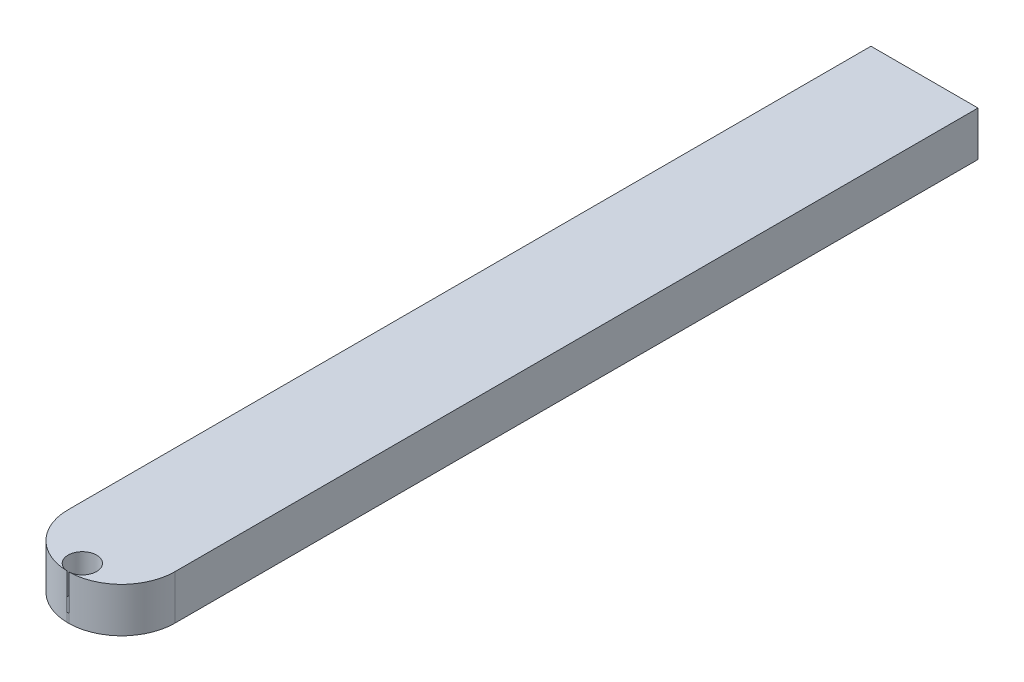
ISO-10303-21;
HEADER;
FILE_DESCRIPTION(('STEP AP214'),'2;1');
FILE_NAME('part.step','',(''),(''),'','','');
FILE_SCHEMA(('AUTOMOTIVE_DESIGN { 1 0 10303 214 1 1 1 1 }'));
ENDSEC;
DATA;
#1=APPLICATION_CONTEXT('core data for automotive mechanical design processes');
#2=APPLICATION_PROTOCOL_DEFINITION('international standard','automotive_design',2000,#1);
#3=PRODUCT_CONTEXT('',#1,'mechanical');
#4=PRODUCT('Part','Part','',(#3));
#5=PRODUCT_RELATED_PRODUCT_CATEGORY('part','',(#4));
#6=PRODUCT_DEFINITION_FORMATION('','',#4);
#7=PRODUCT_DEFINITION_CONTEXT('part definition',#1,'design');
#8=PRODUCT_DEFINITION('design','',#6,#7);
#9=PRODUCT_DEFINITION_SHAPE('','',#8);
#10=(LENGTH_UNIT() NAMED_UNIT(*) SI_UNIT(.MILLI.,.METRE.));
#11=(NAMED_UNIT(*) PLANE_ANGLE_UNIT() SI_UNIT($,.RADIAN.));
#12=(NAMED_UNIT(*) SI_UNIT($,.STERADIAN.) SOLID_ANGLE_UNIT());
#13=UNCERTAINTY_MEASURE_WITH_UNIT(LENGTH_MEASURE(1.E-05),#10,'distance_accuracy_value','');
#14=(GEOMETRIC_REPRESENTATION_CONTEXT(3) GLOBAL_UNCERTAINTY_ASSIGNED_CONTEXT((#13)) GLOBAL_UNIT_ASSIGNED_CONTEXT((#10,
#11,#12)) REPRESENTATION_CONTEXT('',''));
#15=CARTESIAN_POINT('',(0.,0.,0.));
#16=DIRECTION('',(0.,0.,1.));
#17=DIRECTION('',(1.,0.,0.));
#18=AXIS2_PLACEMENT_3D('',#15,#16,#17);
#19=CARTESIAN_POINT('',(0.,5.,4.40206258723675));
#20=DIRECTION('',(0.,-1.,0.));
#21=DIRECTION('',(0.,0.,-1.));
#22=AXIS2_PLACEMENT_3D('',#19,#20,#21);
#23=CYLINDRICAL_SURFACE('',#22,1.6);
#24=CARTESIAN_POINT('',(-0.094699542129148,1.,5.99726916396745));
#25=CARTESIAN_POINT('',(-0.0868499034936325,1.,5.99772445425288));
#26=CARTESIAN_POINT('',(-0.0789969474442039,1.,5.99812233235589));
#27=CARTESIAN_POINT('',(-0.0632689538212298,1.,5.99880471878596));
#28=CARTESIAN_POINT('',(-0.0553939054357609,1.,5.99908897802482));
#29=CARTESIAN_POINT('',(-0.0396217308056037,1.,5.99954414393901));
#30=CARTESIAN_POINT('',(-0.0317245967195704,1.,5.99971477850868));
#31=CARTESIAN_POINT('',(-0.0158849807836073,1.,5.99994299387929));
#32=CARTESIAN_POINT('',(-0.00794248986502298,1.,5.99999994371958));
#33=CARTESIAN_POINT('',(0.00790914376476829,1.,6.00000005604413));
#34=CARTESIAN_POINT('',(0.0158182864848033,1.,5.99994369525441));
#35=CARTESIAN_POINT('',(0.0316367798133749,1.,5.99971742166711));
#36=CARTESIAN_POINT('',(0.0395461300481202,1.,5.99954748264948));
#37=CARTESIAN_POINT('',(0.0553417180087262,1.,5.99909366751565));
#38=CARTESIAN_POINT('',(0.0632279639605156,1.,5.99881007815275));
#39=CARTESIAN_POINT('',(0.0789773337241189,1.,5.99812901664813));
#40=CARTESIAN_POINT('',(0.0868404689508996,1.,5.9977318083539));
#41=CARTESIAN_POINT('',(0.0947002946515451,1.,5.99727716493014));
#42=B_SPLINE_CURVE_WITH_KNOTS('',3,(#24,#25,#26,#27,#28,#29,#30,#31,#32,#33,#34,#35,#36,#37,#38,
#39,#40,#41),.UNSPECIFIED.,.F.,.F.,(4,2,2,2,2,2,2,2,4),(0.,0.0235882653823565,
0.0472279636785825,0.0709240721017153,0.0947513344534593,0.118478559374539,0.142211263726319,
0.165884460898795,0.189503124036694),.UNSPECIFIED.);
#43=CARTESIAN_POINT('',(-0.0947404278631268,1.,5.99797346879338));
#44=VERTEX_POINT('',#43);
#45=CARTESIAN_POINT('',(0.0947406140658361,1.,5.99797345779487));
#46=VERTEX_POINT('',#45);
#47=EDGE_CURVE('E12',#44,#46,#42,.T.);
#48=ORIENTED_EDGE('',*,*,#47,.F.);
#49=DIRECTION('',(0.,-1.,0.));
#50=VECTOR('',#49,1.);
#51=CARTESIAN_POINT('',(-0.0948145753003532,2.5,5.99925080291786));
#52=LINE('',#51,#50);
#53=CARTESIAN_POINT('',(-0.0948145753003532,0.,5.99925080291786));
#54=VERTEX_POINT('',#53);
#55=EDGE_CURVE('E136',#44,#54,#52,.T.);
#56=ORIENTED_EDGE('',*,*,#55,.T.);
#57=CARTESIAN_POINT('',(0.,0.,4.40206258723675));
#58=DIRECTION('',(0.,1.,0.));
#59=DIRECTION('',(-0.0592591095627205,0.,0.998242634800695));
#60=AXIS2_PLACEMENT_3D('',#57,#58,#59);
#61=CIRCLE('',#60,1.6);
#62=CARTESIAN_POINT('',(0.0948145753003532,0.,5.99925080291786));
#63=VERTEX_POINT('',#62);
#64=EDGE_CURVE('E137',#54,#63,#61,.T.);
#65=ORIENTED_EDGE('',*,*,#64,.T.);
#66=DIRECTION('',(0.,-1.,0.));
#67=VECTOR('',#66,1.);
#68=CARTESIAN_POINT('',(0.0948145753003532,2.5,5.99925080291786));
#69=LINE('',#68,#67);
#70=EDGE_CURVE('E77',#63,#46,#69,.F.);
#71=ORIENTED_EDGE('',*,*,#70,.T.);
#72=EDGE_LOOP('',(#48,#56,#65,#71));
#73=FACE_BOUND('',#72,.T.);
#74=ADVANCED_FACE('F53',(#73),#23,.T.);
#75=CARTESIAN_POINT('',(0.,5.,0.));
#76=DIRECTION('',(0.,-1.,0.));
#77=DIRECTION('',(0.,0.,-1.));
#78=AXIS2_PLACEMENT_3D('',#75,#76,#77);
#79=CYLINDRICAL_SURFACE('',#78,6.);
#80=ORIENTED_EDGE('',*,*,#70,.F.);
#81=CARTESIAN_POINT('',(0.,0.,0.));
#82=DIRECTION('',(0.,1.,0.));
#83=DIRECTION('',(0.,0.,1.));
#84=AXIS2_PLACEMENT_3D('',#81,#82,#83);
#85=CIRCLE('',#84,6.);
#86=CARTESIAN_POINT('',(6.,0.,0.));
#87=VERTEX_POINT('',#86);
#88=EDGE_CURVE('E150',#63,#87,#85,.T.);
#89=ORIENTED_EDGE('',*,*,#88,.T.);
#90=DIRECTION('',(0.,-1.,0.));
#91=VECTOR('',#90,1.);
#92=CARTESIAN_POINT('',(6.,5.,0.));
#93=LINE('',#92,#91);
#94=CARTESIAN_POINT('',(6.,5.,0.));
#95=VERTEX_POINT('',#94);
#96=EDGE_CURVE('E246',#95,#87,#93,.T.);
#97=ORIENTED_EDGE('',*,*,#96,.F.);
#98=CARTESIAN_POINT('',(0.,5.,0.));
#99=DIRECTION('',(0.,1.,0.));
#100=DIRECTION('',(0.,0.,1.));
#101=AXIS2_PLACEMENT_3D('',#98,#99,#100);
#102=CIRCLE('',#101,6.);
#103=CARTESIAN_POINT('',(0.0947387917698632,5.,5.99797356477333));
#104=VERTEX_POINT('',#103);
#105=EDGE_CURVE('E132',#104,#95,#102,.T.);
#106=ORIENTED_EDGE('',*,*,#105,.F.);
#107=CARTESIAN_POINT('',(0.0946927195492499,1.,5.99719544479202));
#108=DIRECTION('',(0.,1.,0.));
#109=VECTOR('',#108,1.);
#110=LINE('',#107,#109);
#111=EDGE_CURVE('E122',#46,#104,#110,.T.);
#112=ORIENTED_EDGE('',*,*,#111,.F.);
#113=EDGE_LOOP('',(#80,#89,#97,#106,#112));
#114=FACE_BOUND('',#113,.T.);
#115=ADVANCED_FACE('F128',(#114),#79,.T.);
#116=CARTESIAN_POINT('',(6.,5.,0.));
#117=DIRECTION('',(-1.,0.,0.));
#118=DIRECTION('',(0.,0.,1.));
#119=AXIS2_PLACEMENT_3D('',#116,#117,#118);
#120=PLANE('',#119);
#121=DIRECTION('',(0.,0.,-1.));
#122=VECTOR('',#121,1.);
#123=CARTESIAN_POINT('',(6.,0.,0.));
#124=LINE('',#123,#122);
#125=CARTESIAN_POINT('',(6.,0.,-90.));
#126=VERTEX_POINT('',#125);
#127=EDGE_CURVE('E239',#87,#126,#124,.T.);
#128=ORIENTED_EDGE('',*,*,#127,.T.);
#129=DIRECTION('',(0.,-1.,0.));
#130=VECTOR('',#129,1.);
#131=CARTESIAN_POINT('',(6.,5.,-90.));
#132=LINE('',#131,#130);
#133=CARTESIAN_POINT('',(6.,5.,-90.));
#134=VERTEX_POINT('',#133);
#135=EDGE_CURVE('E248',#134,#126,#132,.T.);
#136=ORIENTED_EDGE('',*,*,#135,.F.);
#137=DIRECTION('',(0.,0.,-1.));
#138=VECTOR('',#137,1.);
#139=CARTESIAN_POINT('',(6.,5.,0.));
#140=LINE('',#139,#138);
#141=EDGE_CURVE('E227',#95,#134,#140,.T.);
#142=ORIENTED_EDGE('',*,*,#141,.F.);
#143=ORIENTED_EDGE('',*,*,#96,.T.);
#144=EDGE_LOOP('',(#128,#136,#142,#143));
#145=FACE_BOUND('',#144,.T.);
#146=ADVANCED_FACE('F179',(#145),#120,.F.);
#147=CARTESIAN_POINT('',(-6.,5.,-90.));
#148=DIRECTION('',(0.,0.,-1.));
#149=DIRECTION('',(-1.,0.,0.));
#150=AXIS2_PLACEMENT_3D('',#147,#148,#149);
#151=PLANE('',#150);
#152=CARTESIAN_POINT('',(0.,2.5,-90.));
#153=DIRECTION('',(0.,0.,-1.));
#154=DIRECTION('',(-1.,0.,0.));
#155=AXIS2_PLACEMENT_3D('',#152,#153,#154);
#156=CIRCLE('',#155,1.95);
#157=CARTESIAN_POINT('',(-1.95,2.5,-90.));
#158=VERTEX_POINT('',#157);
#159=EDGE_CURVE('E123',#158,#158,#156,.T.);
#160=ORIENTED_EDGE('',*,*,#159,.F.);
#161=EDGE_LOOP('',(#160));
#162=FACE_BOUND('',#161,.T.);
#163=DIRECTION('',(1.,0.,0.));
#164=VECTOR('',#163,1.);
#165=CARTESIAN_POINT('',(-6.,0.,-90.));
#166=LINE('',#165,#164);
#167=CARTESIAN_POINT('',(-6.,0.,-90.));
#168=VERTEX_POINT('',#167);
#169=EDGE_CURVE('E236',#168,#126,#166,.T.);
#170=ORIENTED_EDGE('',*,*,#169,.F.);
#171=DIRECTION('',(0.,-1.,0.));
#172=VECTOR('',#171,1.);
#173=CARTESIAN_POINT('',(-6.,5.,-90.));
#174=LINE('',#173,#172);
#175=CARTESIAN_POINT('',(-6.,5.,-90.));
#176=VERTEX_POINT('',#175);
#177=EDGE_CURVE('E249',#176,#168,#174,.T.);
#178=ORIENTED_EDGE('',*,*,#177,.F.);
#179=DIRECTION('',(1.,0.,0.));
#180=VECTOR('',#179,1.);
#181=CARTESIAN_POINT('',(-6.,5.,-90.));
#182=LINE('',#181,#180);
#183=EDGE_CURVE('E265',#176,#134,#182,.T.);
#184=ORIENTED_EDGE('',*,*,#183,.T.);
#185=ORIENTED_EDGE('',*,*,#135,.T.);
#186=EDGE_LOOP('',(#170,#178,#184,#185));
#187=FACE_BOUND('',#186,.T.);
#188=ADVANCED_FACE('F258',(#162,#187),#151,.T.);
#189=CARTESIAN_POINT('',(-6.,5.,0.));
#190=DIRECTION('',(-1.,0.,0.));
#191=DIRECTION('',(0.,0.,1.));
#192=AXIS2_PLACEMENT_3D('',#189,#190,#191);
#193=PLANE('',#192);
#194=DIRECTION('',(0.,0.,-1.));
#195=VECTOR('',#194,1.);
#196=CARTESIAN_POINT('',(-6.,0.,0.));
#197=LINE('',#196,#195);
#198=CARTESIAN_POINT('',(-6.,0.,0.));
#199=VERTEX_POINT('',#198);
#200=EDGE_CURVE('E235',#199,#168,#197,.T.);
#201=ORIENTED_EDGE('',*,*,#200,.F.);
#202=DIRECTION('',(0.,-1.,0.));
#203=VECTOR('',#202,1.);
#204=CARTESIAN_POINT('',(-6.,5.,0.));
#205=LINE('',#204,#203);
#206=CARTESIAN_POINT('',(-6.,5.,0.));
#207=VERTEX_POINT('',#206);
#208=EDGE_CURVE('E135',#207,#199,#205,.T.);
#209=ORIENTED_EDGE('',*,*,#208,.F.);
#210=DIRECTION('',(0.,0.,-1.));
#211=VECTOR('',#210,1.);
#212=CARTESIAN_POINT('',(-6.,5.,0.));
#213=LINE('',#212,#211);
#214=EDGE_CURVE('E253',#207,#176,#213,.T.);
#215=ORIENTED_EDGE('',*,*,#214,.T.);
#216=ORIENTED_EDGE('',*,*,#177,.T.);
#217=EDGE_LOOP('',(#201,#209,#215,#216));
#218=FACE_BOUND('',#217,.T.);
#219=ADVANCED_FACE('F178',(#218),#193,.T.);
#220=CARTESIAN_POINT('',(-0.0946927195492507,4.9999995,5.99719544479202));
#221=DIRECTION('',(0.,-1.,0.));
#222=VECTOR('',#221,1.);
#223=LINE('',#220,#222);
#224=CARTESIAN_POINT('',(-0.0947387765886305,5.,5.99797356544738));
#225=VERTEX_POINT('',#224);
#226=EDGE_CURVE('E65',#225,#44,#223,.T.);
#227=ORIENTED_EDGE('',*,*,#226,.F.);
#228=EDGE_CURVE('E213',#207,#225,#102,.T.);
#229=ORIENTED_EDGE('',*,*,#228,.F.);
#230=ORIENTED_EDGE('',*,*,#208,.T.);
#231=EDGE_CURVE('E143',#199,#54,#85,.T.);
#232=ORIENTED_EDGE('',*,*,#231,.T.);
#233=ORIENTED_EDGE('',*,*,#55,.F.);
#234=EDGE_LOOP('',(#227,#229,#230,#232,#233));
#235=FACE_BOUND('',#234,.T.);
#236=ADVANCED_FACE('F175',(#235),#79,.T.);
#237=CARTESIAN_POINT('',(0.,0.,0.));
#238=DIRECTION('',(0.,1.,0.));
#239=DIRECTION('',(0.,0.,1.));
#240=AXIS2_PLACEMENT_3D('',#237,#238,#239);
#241=PLANE('',#240);
#242=ORIENTED_EDGE('',*,*,#88,.F.);
#243=ORIENTED_EDGE('',*,*,#64,.F.);
#244=ORIENTED_EDGE('',*,*,#231,.F.);
#245=ORIENTED_EDGE('',*,*,#200,.T.);
#246=ORIENTED_EDGE('',*,*,#169,.T.);
#247=ORIENTED_EDGE('',*,*,#127,.F.);
#248=EDGE_LOOP('',(#242,#243,#244,#245,#246,#247));
#249=FACE_BOUND('',#248,.T.);
#250=ADVANCED_FACE('F163',(#249),#241,.F.);
#251=CARTESIAN_POINT('',(0.,5.,0.));
#252=DIRECTION('',(0.,1.,0.));
#253=DIRECTION('',(0.,0.,1.));
#254=AXIS2_PLACEMENT_3D('',#251,#252,#253);
#255=PLANE('',#254);
#256=CARTESIAN_POINT('',(0.,5.,4.4));
#257=DIRECTION('',(0.,1.,0.));
#258=DIRECTION('',(0.0591828905874739,0.,0.998247156500689));
#259=AXIS2_PLACEMENT_3D('',#256,#257,#258);
#260=CIRCLE('',#259,1.6);
#261=EDGE_CURVE('E129',#104,#225,#260,.T.);
#262=ORIENTED_EDGE('',*,*,#261,.F.);
#263=ORIENTED_EDGE('',*,*,#105,.T.);
#264=ORIENTED_EDGE('',*,*,#141,.T.);
#265=ORIENTED_EDGE('',*,*,#183,.F.);
#266=ORIENTED_EDGE('',*,*,#214,.F.);
#267=ORIENTED_EDGE('',*,*,#228,.T.);
#268=EDGE_LOOP('',(#262,#263,#264,#265,#266,#267));
#269=FACE_BOUND('',#268,.T.);
#270=ADVANCED_FACE('F171',(#269),#255,.T.);
#271=CARTESIAN_POINT('',(0.,2.5,-86.));
#272=DIRECTION('',(0.,0.,-1.));
#273=DIRECTION('',(-1.,0.,0.));
#274=AXIS2_PLACEMENT_3D('',#271,#272,#273);
#275=CYLINDRICAL_SURFACE('',#274,1.95);
#276=CARTESIAN_POINT('',(0.,2.5,-86.));
#277=DIRECTION('',(0.,0.,-1.));
#278=DIRECTION('',(-1.,0.,0.));
#279=AXIS2_PLACEMENT_3D('',#276,#277,#278);
#280=CIRCLE('',#279,1.95);
#281=CARTESIAN_POINT('',(-1.95,2.5,-86.));
#282=VERTEX_POINT('',#281);
#283=EDGE_CURVE('E240',#282,#282,#280,.T.);
#284=ORIENTED_EDGE('',*,*,#283,.F.);
#285=EDGE_LOOP('',(#284));
#286=FACE_BOUND('',#285,.T.);
#287=ORIENTED_EDGE('',*,*,#159,.T.);
#288=EDGE_LOOP('',(#287));
#289=FACE_BOUND('',#288,.T.);
#290=ADVANCED_FACE('F309',(#286,#289),#275,.F.);
#291=CARTESIAN_POINT('',(0.,2.5,-86.));
#292=DIRECTION('',(0.,0.,-1.));
#293=DIRECTION('',(-1.,0.,0.));
#294=AXIS2_PLACEMENT_3D('',#291,#292,#293);
#295=PLANE('',#294);
#296=ORIENTED_EDGE('',*,*,#283,.T.);
#297=EDGE_LOOP('',(#296));
#298=FACE_BOUND('',#297,.T.);
#299=ADVANCED_FACE('F284',(#298),#295,.T.);
#300=CARTESIAN_POINT('',(0.,1.,4.4));
#301=DIRECTION('',(0.,1.,0.));
#302=DIRECTION('',(0.,0.,1.));
#303=AXIS2_PLACEMENT_3D('',#300,#301,#302);
#304=CYLINDRICAL_SURFACE('',#303,1.6);
#305=ORIENTED_EDGE('',*,*,#226,.T.);
#306=CARTESIAN_POINT('',(0.,1.,4.4));
#307=DIRECTION('',(0.,1.,0.));
#308=DIRECTION('',(0.,0.,1.));
#309=AXIS2_PLACEMENT_3D('',#306,#307,#308);
#310=CIRCLE('',#309,1.6);
#311=EDGE_CURVE('E68',#46,#44,#310,.T.);
#312=ORIENTED_EDGE('',*,*,#311,.F.);
#313=ORIENTED_EDGE('',*,*,#111,.T.);
#314=ORIENTED_EDGE('',*,*,#261,.T.);
#315=EDGE_LOOP('',(#305,#312,#313,#314));
#316=FACE_BOUND('',#315,.T.);
#317=ADVANCED_FACE('F119',(#316),#304,.F.);
#318=CARTESIAN_POINT('',(0.,1.,4.4));
#319=DIRECTION('',(0.,1.,0.));
#320=DIRECTION('',(0.,0.,1.));
#321=AXIS2_PLACEMENT_3D('',#318,#319,#320);
#322=PLANE('',#321);
#323=ORIENTED_EDGE('',*,*,#311,.T.);
#324=ORIENTED_EDGE('',*,*,#47,.T.);
#325=EDGE_LOOP('',(#323,#324));
#326=FACE_BOUND('',#325,.T.);
#327=ADVANCED_FACE('F113',(#326),#322,.T.);
#328=CLOSED_SHELL('',(#74,#115,#146,#188,#219,#236,#250,#270,#290,#299,#317,#327));
#329=MANIFOLD_SOLID_BREP('B2',#328);
#330=ADVANCED_BREP_SHAPE_REPRESENTATION('',(#18,#329),#14);
#331=SHAPE_DEFINITION_REPRESENTATION(#9,#330);
ENDSEC;
END-ISO-10303-21;
